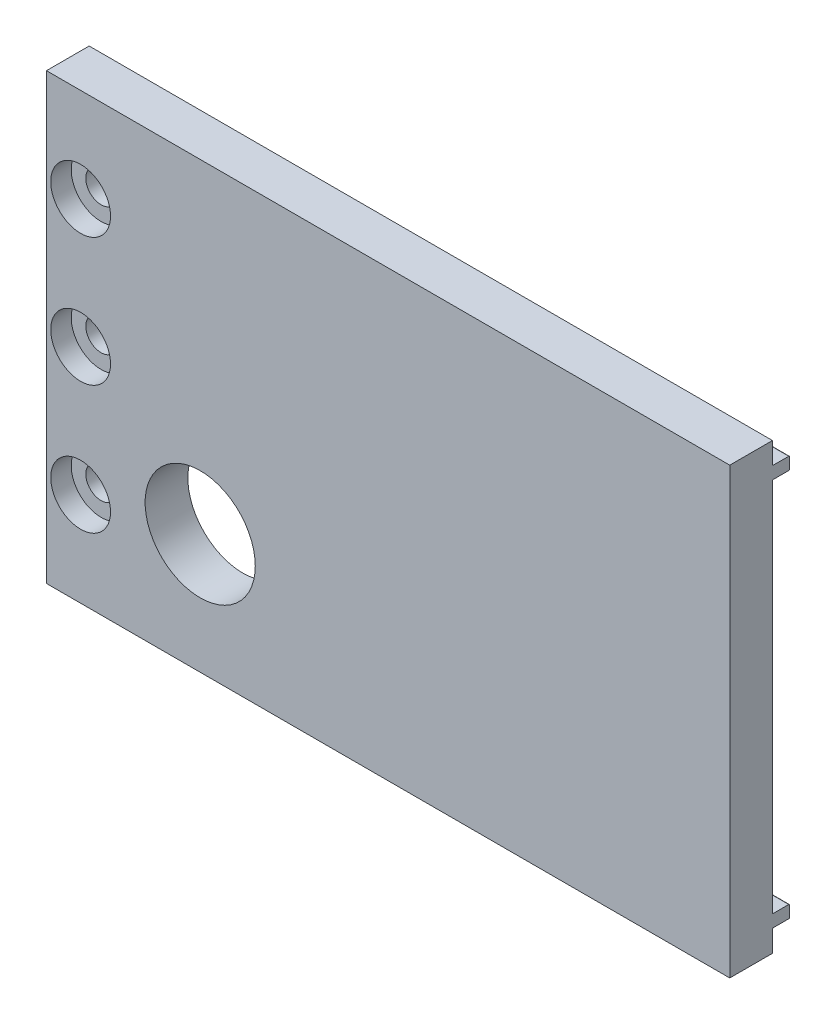
ISO-10303-21;
HEADER;
FILE_DESCRIPTION(('STEP AP214'),'2;1');
FILE_NAME('part.step','',(''),(''),'','','');
FILE_SCHEMA(('AUTOMOTIVE_DESIGN { 1 0 10303 214 1 1 1 1 }'));
ENDSEC;
DATA;
#1=APPLICATION_CONTEXT('core data for automotive mechanical design processes');
#2=APPLICATION_PROTOCOL_DEFINITION('international standard','automotive_design',2000,#1);
#3=PRODUCT_CONTEXT('',#1,'mechanical');
#4=PRODUCT('Part','Part','',(#3));
#5=PRODUCT_RELATED_PRODUCT_CATEGORY('part','',(#4));
#6=PRODUCT_DEFINITION_FORMATION('','',#4);
#7=PRODUCT_DEFINITION_CONTEXT('part definition',#1,'design');
#8=PRODUCT_DEFINITION('design','',#6,#7);
#9=PRODUCT_DEFINITION_SHAPE('','',#8);
#10=(LENGTH_UNIT() NAMED_UNIT(*) SI_UNIT(.MILLI.,.METRE.));
#11=(NAMED_UNIT(*) PLANE_ANGLE_UNIT() SI_UNIT($,.RADIAN.));
#12=(NAMED_UNIT(*) SI_UNIT($,.STERADIAN.) SOLID_ANGLE_UNIT());
#13=UNCERTAINTY_MEASURE_WITH_UNIT(LENGTH_MEASURE(1.E-05),#10,'distance_accuracy_value','');
#14=(GEOMETRIC_REPRESENTATION_CONTEXT(3) GLOBAL_UNCERTAINTY_ASSIGNED_CONTEXT((#13)) GLOBAL_UNIT_ASSIGNED_CONTEXT((#10,
#11,#12)) REPRESENTATION_CONTEXT('',''));
#15=CARTESIAN_POINT('',(0.,0.,0.));
#16=DIRECTION('',(0.,0.,1.));
#17=DIRECTION('',(1.,0.,0.));
#18=AXIS2_PLACEMENT_3D('',#15,#16,#17);
#19=CARTESIAN_POINT('',(0.,0.,16.9801166404574));
#20=DIRECTION('',(0.,0.,1.));
#21=DIRECTION('',(1.,0.,0.));
#22=AXIS2_PLACEMENT_3D('',#19,#20,#21);
#23=PLANE('',#22);
#24=CARTESIAN_POINT('',(-80.4443030659333,9.06656930573061,16.9801166404574));
#25=DIRECTION('',(0.,0.,1.));
#26=DIRECTION('',(1.,0.,0.));
#27=AXIS2_PLACEMENT_3D('',#24,#25,#26);
#28=CIRCLE('',#27,1.8);
#29=CARTESIAN_POINT('',(-78.6443030659333,9.06656930573061,16.9801166404574));
#30=VERTEX_POINT('',#29);
#31=EDGE_CURVE('E328',#30,#30,#28,.T.);
#32=ORIENTED_EDGE('',*,*,#31,.T.);
#33=EDGE_LOOP('',(#32));
#34=FACE_BOUND('',#33,.T.);
#35=CARTESIAN_POINT('',(-80.4443030659333,24.0665693057306,16.9801166404574));
#36=DIRECTION('',(0.,0.,1.));
#37=DIRECTION('',(1.,0.,0.));
#38=AXIS2_PLACEMENT_3D('',#35,#36,#37);
#39=CIRCLE('',#38,1.8);
#40=CARTESIAN_POINT('',(-78.6443030659333,24.0665693057306,16.9801166404574));
#41=VERTEX_POINT('',#40);
#42=EDGE_CURVE('E316',#41,#41,#39,.T.);
#43=ORIENTED_EDGE('',*,*,#42,.T.);
#44=EDGE_LOOP('',(#43));
#45=FACE_BOUND('',#44,.T.);
#46=CARTESIAN_POINT('',(-80.4443030659333,39.0665693057306,16.9801166404574));
#47=DIRECTION('',(0.,0.,1.));
#48=DIRECTION('',(1.,0.,0.));
#49=AXIS2_PLACEMENT_3D('',#46,#47,#48);
#50=CIRCLE('',#49,1.8);
#51=CARTESIAN_POINT('',(-78.6443030659333,39.0665693057306,16.9801166404574));
#52=VERTEX_POINT('',#51);
#53=EDGE_CURVE('E302',#52,#52,#50,.T.);
#54=ORIENTED_EDGE('',*,*,#53,.T.);
#55=EDGE_LOOP('',(#54));
#56=FACE_BOUND('',#55,.T.);
#57=CARTESIAN_POINT('',(-66.4443030659333,12.061734253213,16.9801166404574));
#58=DIRECTION('',(0.,0.,1.));
#59=DIRECTION('',(1.,0.,0.));
#60=AXIS2_PLACEMENT_3D('',#57,#58,#59);
#61=CIRCLE('',#60,6.44785946430932);
#62=CARTESIAN_POINT('',(-59.996443601624,12.061734253213,16.9801166404574));
#63=VERTEX_POINT('',#62);
#64=EDGE_CURVE('E293',#63,#63,#61,.T.);
#65=ORIENTED_EDGE('',*,*,#64,.T.);
#66=EDGE_LOOP('',(#65));
#67=FACE_BOUND('',#66,.T.);
#68=DIRECTION('',(0.,1.,0.));
#69=VECTOR('',#68,1.);
#70=CARTESIAN_POINT('',(-76.4443030659333,46.0665693057306,16.9801166404574));
#71=LINE('',#70,#69);
#72=CARTESIAN_POINT('',(-76.4443030659333,45.9665693057306,16.9801166404574));
#73=VERTEX_POINT('',#72);
#74=CARTESIAN_POINT('',(-76.4443030659333,47.6165693057306,16.9801166404574));
#75=VERTEX_POINT('',#74);
#76=EDGE_CURVE('E48',#73,#75,#71,.T.);
#77=ORIENTED_EDGE('',*,*,#76,.F.);
#78=DIRECTION('',(-1.,0.,0.));
#79=VECTOR('',#78,1.);
#80=CARTESIAN_POINT('',(-4.4443030659333,45.9665693057306,16.9801166404574));
#81=LINE('',#80,#79);
#82=CARTESIAN_POINT('',(-4.44430306593331,45.9665693057306,16.9801166404574));
#83=VERTEX_POINT('',#82);
#84=EDGE_CURVE('E251',#73,#83,#81,.F.);
#85=ORIENTED_EDGE('',*,*,#84,.T.);
#86=DIRECTION('',(0.,1.,0.));
#87=VECTOR('',#86,1.);
#88=CARTESIAN_POINT('',(-4.44430306593331,50.0665693057306,16.9801166404574));
#89=LINE('',#88,#87);
#90=CARTESIAN_POINT('',(-4.4443030659333,2.16656930573062,16.9801166404574));
#91=VERTEX_POINT('',#90);
#92=EDGE_CURVE('E283',#91,#83,#89,.T.);
#93=ORIENTED_EDGE('',*,*,#92,.F.);
#94=DIRECTION('',(1.,0.,0.));
#95=VECTOR('',#94,1.);
#96=CARTESIAN_POINT('',(-76.4443030659333,2.16656930573061,16.9801166404574));
#97=LINE('',#96,#95);
#98=CARTESIAN_POINT('',(-76.4443030659333,2.16656930573061,16.9801166404574));
#99=VERTEX_POINT('',#98);
#100=EDGE_CURVE('E246',#91,#99,#97,.F.);
#101=ORIENTED_EDGE('',*,*,#100,.T.);
#102=DIRECTION('',(0.,1.,0.));
#103=VECTOR('',#102,1.);
#104=CARTESIAN_POINT('',(-76.4443030659333,2.06656930573061,16.9801166404574));
#105=LINE('',#104,#103);
#106=CARTESIAN_POINT('',(-76.4443030659333,0.516569305730608,16.9801166404574));
#107=VERTEX_POINT('',#106);
#108=EDGE_CURVE('E270',#107,#99,#105,.T.);
#109=ORIENTED_EDGE('',*,*,#108,.F.);
#110=DIRECTION('',(-1.,0.,0.));
#111=VECTOR('',#110,1.);
#112=CARTESIAN_POINT('',(-4.4443030659333,0.516569305730608,16.9801166404574));
#113=LINE('',#112,#111);
#114=CARTESIAN_POINT('',(-4.4443030659333,0.516569305730623,16.9801166404574));
#115=VERTEX_POINT('',#114);
#116=EDGE_CURVE('E244',#107,#115,#113,.F.);
#117=ORIENTED_EDGE('',*,*,#116,.T.);
#118=CARTESIAN_POINT('',(-4.4443030659333,-1.93343069426939,16.9801166404574));
#119=VERTEX_POINT('',#118);
#120=EDGE_CURVE('E278',#119,#115,#89,.T.);
#121=ORIENTED_EDGE('',*,*,#120,.F.);
#122=DIRECTION('',(1.,0.,0.));
#123=VECTOR('',#122,1.);
#124=CARTESIAN_POINT('',(-84.4443030659333,-1.93343069426939,16.9801166404574));
#125=LINE('',#124,#123);
#126=CARTESIAN_POINT('',(-84.4443030659333,-1.93343069426939,16.9801166404574));
#127=VERTEX_POINT('',#126);
#128=EDGE_CURVE('E289',#127,#119,#125,.T.);
#129=ORIENTED_EDGE('',*,*,#128,.F.);
#130=DIRECTION('',(0.,-1.,0.));
#131=VECTOR('',#130,1.);
#132=CARTESIAN_POINT('',(-84.4443030659333,50.0665693057306,16.9801166404574));
#133=LINE('',#132,#131);
#134=CARTESIAN_POINT('',(-84.4443030659333,50.0665693057306,16.9801166404574));
#135=VERTEX_POINT('',#134);
#136=EDGE_CURVE('E190',#135,#127,#133,.T.);
#137=ORIENTED_EDGE('',*,*,#136,.F.);
#138=DIRECTION('',(-1.,0.,0.));
#139=VECTOR('',#138,1.);
#140=CARTESIAN_POINT('',(-84.4443030659333,50.0665693057306,16.9801166404574));
#141=LINE('',#140,#139);
#142=CARTESIAN_POINT('',(-4.44430306593331,50.0665693057306,16.9801166404574));
#143=VERTEX_POINT('',#142);
#144=EDGE_CURVE('E186',#143,#135,#141,.T.);
#145=ORIENTED_EDGE('',*,*,#144,.F.);
#146=CARTESIAN_POINT('',(-4.44430306593331,47.6165693057306,16.9801166404574));
#147=VERTEX_POINT('',#146);
#148=EDGE_CURVE('E285',#147,#143,#89,.T.);
#149=ORIENTED_EDGE('',*,*,#148,.F.);
#150=DIRECTION('',(1.,0.,0.));
#151=VECTOR('',#150,1.);
#152=CARTESIAN_POINT('',(-76.4443030659333,47.6165693057306,16.9801166404574));
#153=LINE('',#152,#151);
#154=EDGE_CURVE('E249',#147,#75,#153,.F.);
#155=ORIENTED_EDGE('',*,*,#154,.T.);
#156=EDGE_LOOP('',(#77,#85,#93,#101,#109,#117,#121,#129,#137,#145,#149,#155));
#157=FACE_BOUND('',#156,.T.);
#158=ADVANCED_FACE('F33',(#34,#45,#56,#67,#157),#23,.F.);
#159=CARTESIAN_POINT('',(-84.4443030659333,50.0665693057306,21.9801166404574));
#160=DIRECTION('',(1.,0.,0.));
#161=DIRECTION('',(0.,1.,0.));
#162=AXIS2_PLACEMENT_3D('',#159,#160,#161);
#163=PLANE('',#162);
#164=ORIENTED_EDGE('',*,*,#136,.T.);
#165=DIRECTION('',(0.,0.,-1.));
#166=VECTOR('',#165,1.);
#167=CARTESIAN_POINT('',(-84.4443030659333,-1.93343069426939,21.9801166404574));
#168=LINE('',#167,#166);
#169=CARTESIAN_POINT('',(-84.4443030659333,-1.93343069426939,21.9801166404574));
#170=VERTEX_POINT('',#169);
#171=EDGE_CURVE('E170',#170,#127,#168,.T.);
#172=ORIENTED_EDGE('',*,*,#171,.F.);
#173=DIRECTION('',(0.,-1.,0.));
#174=VECTOR('',#173,1.);
#175=CARTESIAN_POINT('',(-84.4443030659333,50.0665693057306,21.9801166404574));
#176=LINE('',#175,#174);
#177=CARTESIAN_POINT('',(-84.4443030659333,50.0665693057306,21.9801166404574));
#178=VERTEX_POINT('',#177);
#179=EDGE_CURVE('E177',#178,#170,#176,.T.);
#180=ORIENTED_EDGE('',*,*,#179,.F.);
#181=DIRECTION('',(0.,0.,-1.));
#182=VECTOR('',#181,1.);
#183=CARTESIAN_POINT('',(-84.4443030659333,50.0665693057306,21.9801166404574));
#184=LINE('',#183,#182);
#185=EDGE_CURVE('E297',#178,#135,#184,.T.);
#186=ORIENTED_EDGE('',*,*,#185,.T.);
#187=EDGE_LOOP('',(#164,#172,#180,#186));
#188=FACE_BOUND('',#187,.T.);
#189=ADVANCED_FACE('F188',(#188),#163,.F.);
#190=CARTESIAN_POINT('',(-84.4443030659333,-1.93343069426939,21.9801166404574));
#191=DIRECTION('',(0.,1.,0.));
#192=DIRECTION('',(0.,0.,1.));
#193=AXIS2_PLACEMENT_3D('',#190,#191,#192);
#194=PLANE('',#193);
#195=ORIENTED_EDGE('',*,*,#128,.T.);
#196=DIRECTION('',(0.,0.,-1.));
#197=VECTOR('',#196,1.);
#198=CARTESIAN_POINT('',(-4.4443030659333,-1.93343069426939,21.9801166404574));
#199=LINE('',#198,#197);
#200=CARTESIAN_POINT('',(-4.4443030659333,-1.93343069426939,21.9801166404574));
#201=VERTEX_POINT('',#200);
#202=EDGE_CURVE('E173',#201,#119,#199,.T.);
#203=ORIENTED_EDGE('',*,*,#202,.F.);
#204=DIRECTION('',(1.,0.,0.));
#205=VECTOR('',#204,1.);
#206=CARTESIAN_POINT('',(-84.4443030659333,-1.93343069426939,21.9801166404574));
#207=LINE('',#206,#205);
#208=EDGE_CURVE('E166',#170,#201,#207,.T.);
#209=ORIENTED_EDGE('',*,*,#208,.F.);
#210=ORIENTED_EDGE('',*,*,#171,.T.);
#211=EDGE_LOOP('',(#195,#203,#209,#210));
#212=FACE_BOUND('',#211,.T.);
#213=ADVANCED_FACE('F168',(#212),#194,.F.);
#214=CARTESIAN_POINT('',(-4.44430306593331,50.0665693057306,21.9801166404574));
#215=DIRECTION('',(-1.,0.,0.));
#216=DIRECTION('',(0.,-1.,0.));
#217=AXIS2_PLACEMENT_3D('',#214,#215,#216);
#218=PLANE('',#217);
#219=DIRECTION('',(0.,0.,1.));
#220=VECTOR('',#219,1.);
#221=CARTESIAN_POINT('',(-4.4443030659333,0.616569305730608,14.9801166404574));
#222=LINE('',#221,#220);
#223=CARTESIAN_POINT('',(-4.4443030659333,0.616569305730608,15.0801166404574));
#224=VERTEX_POINT('',#223);
#225=CARTESIAN_POINT('',(-4.4443030659333,0.616569305730608,16.8801166404574));
#226=VERTEX_POINT('',#225);
#227=EDGE_CURVE('E340',#224,#226,#222,.T.);
#228=ORIENTED_EDGE('',*,*,#227,.F.);
#229=CARTESIAN_POINT('',(-4.4443030659333,0.716569305730608,15.0801166404574));
#230=DIRECTION('',(-1.,0.,0.));
#231=DIRECTION('',(0.,-1.,0.));
#232=AXIS2_PLACEMENT_3D('',#229,#230,#231);
#233=CIRCLE('',#232,0.1);
#234=CARTESIAN_POINT('',(-4.4443030659333,0.716569305730608,14.9801166404574));
#235=VERTEX_POINT('',#234);
#236=EDGE_CURVE('E217',#224,#235,#233,.F.);
#237=ORIENTED_EDGE('',*,*,#236,.T.);
#238=DIRECTION('',(0.,-1.,0.));
#239=VECTOR('',#238,1.);
#240=CARTESIAN_POINT('',(-4.4443030659333,2.06656930573061,14.9801166404574));
#241=LINE('',#240,#239);
#242=CARTESIAN_POINT('',(-4.4443030659333,1.96656930573061,14.9801166404574));
#243=VERTEX_POINT('',#242);
#244=EDGE_CURVE('E351',#243,#235,#241,.T.);
#245=ORIENTED_EDGE('',*,*,#244,.F.);
#246=CARTESIAN_POINT('',(-4.4443030659333,1.96656930573061,15.0801166404574));
#247=DIRECTION('',(-1.,0.,0.));
#248=DIRECTION('',(0.,-1.,0.));
#249=AXIS2_PLACEMENT_3D('',#246,#247,#248);
#250=CIRCLE('',#249,0.1);
#251=CARTESIAN_POINT('',(-4.4443030659333,2.06656930573061,15.0801166404574));
#252=VERTEX_POINT('',#251);
#253=EDGE_CURVE('E215',#243,#252,#250,.F.);
#254=ORIENTED_EDGE('',*,*,#253,.T.);
#255=DIRECTION('',(0.,0.,1.));
#256=VECTOR('',#255,1.);
#257=CARTESIAN_POINT('',(-4.4443030659333,2.06656930573061,14.9801166404574));
#258=LINE('',#257,#256);
#259=CARTESIAN_POINT('',(-4.4443030659333,2.06656930573061,16.8801166404574));
#260=VERTEX_POINT('',#259);
#261=EDGE_CURVE('E346',#252,#260,#258,.T.);
#262=ORIENTED_EDGE('',*,*,#261,.T.);
#263=CARTESIAN_POINT('',(-4.4443030659333,2.16656930573061,16.8801166404574));
#264=DIRECTION('',(-1.,0.,0.));
#265=DIRECTION('',(0.,-1.,0.));
#266=AXIS2_PLACEMENT_3D('',#263,#264,#265);
#267=CIRCLE('',#266,0.1);
#268=EDGE_CURVE('E261',#260,#91,#267,.T.);
#269=ORIENTED_EDGE('',*,*,#268,.T.);
#270=ORIENTED_EDGE('',*,*,#92,.T.);
#271=CARTESIAN_POINT('',(-4.44430306593331,45.9665693057306,16.8801166404574));
#272=DIRECTION('',(-1.,0.,0.));
#273=DIRECTION('',(0.,-1.,0.));
#274=AXIS2_PLACEMENT_3D('',#271,#272,#273);
#275=CIRCLE('',#274,0.1);
#276=CARTESIAN_POINT('',(-4.4443030659333,46.0665693057306,16.8801166404574));
#277=VERTEX_POINT('',#276);
#278=EDGE_CURVE('E255',#83,#277,#275,.T.);
#279=ORIENTED_EDGE('',*,*,#278,.T.);
#280=DIRECTION('',(0.,0.,1.));
#281=VECTOR('',#280,1.);
#282=CARTESIAN_POINT('',(-4.4443030659333,46.0665693057306,14.9801166404574));
#283=LINE('',#282,#281);
#284=CARTESIAN_POINT('',(-4.4443030659333,46.0665693057306,15.0801166404574));
#285=VERTEX_POINT('',#284);
#286=EDGE_CURVE('E365',#285,#277,#283,.T.);
#287=ORIENTED_EDGE('',*,*,#286,.F.);
#288=CARTESIAN_POINT('',(-4.44430306593331,46.1665693057306,15.0801166404574));
#289=DIRECTION('',(-1.,0.,0.));
#290=DIRECTION('',(0.,-1.,0.));
#291=AXIS2_PLACEMENT_3D('',#288,#289,#290);
#292=CIRCLE('',#291,0.1);
#293=CARTESIAN_POINT('',(-4.4443030659333,46.1665693057306,14.9801166404574));
#294=VERTEX_POINT('',#293);
#295=EDGE_CURVE('E211',#285,#294,#292,.F.);
#296=ORIENTED_EDGE('',*,*,#295,.T.);
#297=DIRECTION('',(0.,-1.,0.));
#298=VECTOR('',#297,1.);
#299=CARTESIAN_POINT('',(-4.4443030659333,46.0665693057306,14.9801166404574));
#300=LINE('',#299,#298);
#301=CARTESIAN_POINT('',(-4.4443030659333,47.4165693057306,14.9801166404574));
#302=VERTEX_POINT('',#301);
#303=EDGE_CURVE('E368',#302,#294,#300,.T.);
#304=ORIENTED_EDGE('',*,*,#303,.F.);
#305=CARTESIAN_POINT('',(-4.44430306593331,47.4165693057306,15.0801166404574));
#306=DIRECTION('',(-1.,0.,0.));
#307=DIRECTION('',(0.,-1.,0.));
#308=AXIS2_PLACEMENT_3D('',#305,#306,#307);
#309=CIRCLE('',#308,0.1);
#310=CARTESIAN_POINT('',(-4.4443030659333,47.5165693057306,15.0801166404574));
#311=VERTEX_POINT('',#310);
#312=EDGE_CURVE('E213',#302,#311,#309,.F.);
#313=ORIENTED_EDGE('',*,*,#312,.T.);
#314=DIRECTION('',(0.,0.,1.));
#315=VECTOR('',#314,1.);
#316=CARTESIAN_POINT('',(-4.4443030659333,47.5165693057306,14.9801166404574));
#317=LINE('',#316,#315);
#318=CARTESIAN_POINT('',(-4.4443030659333,47.5165693057306,16.8801166404574));
#319=VERTEX_POINT('',#318);
#320=EDGE_CURVE('E362',#311,#319,#317,.T.);
#321=ORIENTED_EDGE('',*,*,#320,.T.);
#322=CARTESIAN_POINT('',(-4.44430306593331,47.6165693057306,16.8801166404574));
#323=DIRECTION('',(-1.,0.,0.));
#324=DIRECTION('',(0.,-1.,0.));
#325=AXIS2_PLACEMENT_3D('',#322,#323,#324);
#326=CIRCLE('',#325,0.1);
#327=EDGE_CURVE('E257',#319,#147,#326,.T.);
#328=ORIENTED_EDGE('',*,*,#327,.T.);
#329=ORIENTED_EDGE('',*,*,#148,.T.);
#330=DIRECTION('',(0.,0.,-1.));
#331=VECTOR('',#330,1.);
#332=CARTESIAN_POINT('',(-4.44430306593331,50.0665693057306,21.9801166404574));
#333=LINE('',#332,#331);
#334=CARTESIAN_POINT('',(-4.44430306593331,50.0665693057306,21.9801166404574));
#335=VERTEX_POINT('',#334);
#336=EDGE_CURVE('E196',#335,#143,#333,.T.);
#337=ORIENTED_EDGE('',*,*,#336,.F.);
#338=DIRECTION('',(0.,1.,0.));
#339=VECTOR('',#338,1.);
#340=CARTESIAN_POINT('',(-4.44430306593331,50.0665693057306,21.9801166404574));
#341=LINE('',#340,#339);
#342=EDGE_CURVE('E176',#201,#335,#341,.T.);
#343=ORIENTED_EDGE('',*,*,#342,.F.);
#344=ORIENTED_EDGE('',*,*,#202,.T.);
#345=ORIENTED_EDGE('',*,*,#120,.T.);
#346=CARTESIAN_POINT('',(-4.4443030659333,0.516569305730608,16.8801166404574));
#347=DIRECTION('',(-1.,0.,0.));
#348=DIRECTION('',(0.,-1.,0.));
#349=AXIS2_PLACEMENT_3D('',#346,#347,#348);
#350=CIRCLE('',#349,0.1);
#351=EDGE_CURVE('E11',#115,#226,#350,.T.);
#352=ORIENTED_EDGE('',*,*,#351,.T.);
#353=EDGE_LOOP('',(#228,#237,#245,#254,#262,#269,#270,#279,#287,#296,#304,#313,#321,#328,#329,
#337,#343,#344,#345,#352));
#354=FACE_BOUND('',#353,.T.);
#355=ADVANCED_FACE('F281',(#354),#218,.F.);
#356=CARTESIAN_POINT('',(-84.4443030659333,50.0665693057306,21.9801166404574));
#357=DIRECTION('',(0.,-1.,0.));
#358=DIRECTION('',(0.,0.,-1.));
#359=AXIS2_PLACEMENT_3D('',#356,#357,#358);
#360=PLANE('',#359);
#361=ORIENTED_EDGE('',*,*,#144,.T.);
#362=ORIENTED_EDGE('',*,*,#185,.F.);
#363=DIRECTION('',(-1.,0.,0.));
#364=VECTOR('',#363,1.);
#365=CARTESIAN_POINT('',(-84.4443030659333,50.0665693057306,21.9801166404574));
#366=LINE('',#365,#364);
#367=EDGE_CURVE('E182',#335,#178,#366,.T.);
#368=ORIENTED_EDGE('',*,*,#367,.F.);
#369=ORIENTED_EDGE('',*,*,#336,.T.);
#370=EDGE_LOOP('',(#361,#362,#368,#369));
#371=FACE_BOUND('',#370,.T.);
#372=ADVANCED_FACE('F395',(#371),#360,.F.);
#373=CARTESIAN_POINT('',(0.,0.,21.9801166404574));
#374=DIRECTION('',(0.,0.,1.));
#375=DIRECTION('',(1.,0.,0.));
#376=AXIS2_PLACEMENT_3D('',#373,#374,#375);
#377=PLANE('',#376);
#378=CARTESIAN_POINT('',(-80.4443030659333,9.06656930573061,21.9801166404574));
#379=DIRECTION('',(0.,0.,1.));
#380=DIRECTION('',(1.,0.,0.));
#381=AXIS2_PLACEMENT_3D('',#378,#379,#380);
#382=CIRCLE('',#381,3.5);
#383=CARTESIAN_POINT('',(-76.9443030659333,9.06656930573061,21.9801166404574));
#384=VERTEX_POINT('',#383);
#385=EDGE_CURVE('E337',#384,#384,#382,.T.);
#386=ORIENTED_EDGE('',*,*,#385,.F.);
#387=EDGE_LOOP('',(#386));
#388=FACE_BOUND('',#387,.T.);
#389=CARTESIAN_POINT('',(-80.4443030659333,24.0665693057306,21.9801166404574));
#390=DIRECTION('',(0.,0.,1.));
#391=DIRECTION('',(1.,0.,0.));
#392=AXIS2_PLACEMENT_3D('',#389,#390,#391);
#393=CIRCLE('',#392,3.5);
#394=CARTESIAN_POINT('',(-76.9443030659333,24.0665693057306,21.9801166404574));
#395=VERTEX_POINT('',#394);
#396=EDGE_CURVE('E325',#395,#395,#393,.T.);
#397=ORIENTED_EDGE('',*,*,#396,.F.);
#398=EDGE_LOOP('',(#397));
#399=FACE_BOUND('',#398,.T.);
#400=CARTESIAN_POINT('',(-80.4443030659333,39.0665693057306,21.9801166404574));
#401=DIRECTION('',(0.,0.,1.));
#402=DIRECTION('',(1.,0.,0.));
#403=AXIS2_PLACEMENT_3D('',#400,#401,#402);
#404=CIRCLE('',#403,3.5);
#405=CARTESIAN_POINT('',(-76.9443030659333,39.0665693057306,21.9801166404574));
#406=VERTEX_POINT('',#405);
#407=EDGE_CURVE('E313',#406,#406,#404,.T.);
#408=ORIENTED_EDGE('',*,*,#407,.F.);
#409=EDGE_LOOP('',(#408));
#410=FACE_BOUND('',#409,.T.);
#411=CARTESIAN_POINT('',(-66.4443030659333,12.061734253213,21.9801166404574));
#412=DIRECTION('',(0.,0.,1.));
#413=DIRECTION('',(1.,0.,0.));
#414=AXIS2_PLACEMENT_3D('',#411,#412,#413);
#415=CIRCLE('',#414,6.44785946430932);
#416=CARTESIAN_POINT('',(-59.996443601624,12.061734253213,21.9801166404574));
#417=VERTEX_POINT('',#416);
#418=EDGE_CURVE('E299',#417,#417,#415,.T.);
#419=ORIENTED_EDGE('',*,*,#418,.F.);
#420=EDGE_LOOP('',(#419));
#421=FACE_BOUND('',#420,.T.);
#422=ORIENTED_EDGE('',*,*,#179,.T.);
#423=ORIENTED_EDGE('',*,*,#208,.T.);
#424=ORIENTED_EDGE('',*,*,#342,.T.);
#425=ORIENTED_EDGE('',*,*,#367,.T.);
#426=EDGE_LOOP('',(#422,#423,#424,#425));
#427=FACE_BOUND('',#426,.T.);
#428=ADVANCED_FACE('F180',(#388,#399,#410,#421,#427),#377,.T.);
#429=CARTESIAN_POINT('',(-66.4443030659333,12.061734253213,16.9801166404574));
#430=DIRECTION('',(0.,0.,1.));
#431=DIRECTION('',(1.,0.,0.));
#432=AXIS2_PLACEMENT_3D('',#429,#430,#431);
#433=CYLINDRICAL_SURFACE('',#432,6.44785946430932);
#434=ORIENTED_EDGE('',*,*,#64,.F.);
#435=EDGE_LOOP('',(#434));
#436=FACE_BOUND('',#435,.T.);
#437=ORIENTED_EDGE('',*,*,#418,.T.);
#438=EDGE_LOOP('',(#437));
#439=FACE_BOUND('',#438,.T.);
#440=ADVANCED_FACE('F403',(#436,#439),#433,.F.);
#441=CARTESIAN_POINT('',(-80.4443030659333,39.0665693057306,21.9801166404574));
#442=DIRECTION('',(0.,0.,1.));
#443=DIRECTION('',(1.,0.,0.));
#444=AXIS2_PLACEMENT_3D('',#441,#442,#443);
#445=CYLINDRICAL_SURFACE('',#444,1.8);
#446=ORIENTED_EDGE('',*,*,#53,.F.);
#447=EDGE_LOOP('',(#446));
#448=FACE_BOUND('',#447,.T.);
#449=CARTESIAN_POINT('',(-80.4443030659333,39.0665693057306,19.5801166404574));
#450=DIRECTION('',(0.,0.,1.));
#451=DIRECTION('',(1.,0.,0.));
#452=AXIS2_PLACEMENT_3D('',#449,#450,#451);
#453=CIRCLE('',#452,1.8);
#454=CARTESIAN_POINT('',(-78.6443030659333,39.0665693057306,19.5801166404574));
#455=VERTEX_POINT('',#454);
#456=EDGE_CURVE('E307',#455,#455,#453,.T.);
#457=ORIENTED_EDGE('',*,*,#456,.T.);
#458=EDGE_LOOP('',(#457));
#459=FACE_BOUND('',#458,.T.);
#460=ADVANCED_FACE('F418',(#448,#459),#445,.F.);
#461=CARTESIAN_POINT('',(-78.6443030659333,39.0665693057306,19.5801166404574));
#462=DIRECTION('',(0.,0.,-1.));
#463=DIRECTION('',(-1.,0.,0.));
#464=AXIS2_PLACEMENT_3D('',#461,#462,#463);
#465=PLANE('',#464);
#466=ORIENTED_EDGE('',*,*,#456,.F.);
#467=EDGE_LOOP('',(#466));
#468=FACE_BOUND('',#467,.T.);
#469=CARTESIAN_POINT('',(-80.4443030659333,39.0665693057306,19.5801166404574));
#470=DIRECTION('',(0.,0.,1.));
#471=DIRECTION('',(1.,0.,0.));
#472=AXIS2_PLACEMENT_3D('',#469,#470,#471);
#473=CIRCLE('',#472,3.5);
#474=CARTESIAN_POINT('',(-76.9443030659333,39.0665693057306,19.5801166404574));
#475=VERTEX_POINT('',#474);
#476=EDGE_CURVE('E310',#475,#475,#473,.T.);
#477=ORIENTED_EDGE('',*,*,#476,.T.);
#478=EDGE_LOOP('',(#477));
#479=FACE_BOUND('',#478,.T.);
#480=ADVANCED_FACE('F422',(#468,#479),#465,.F.);
#481=CARTESIAN_POINT('',(-80.4443030659333,39.0665693057306,21.9801166404574));
#482=DIRECTION('',(0.,0.,1.));
#483=DIRECTION('',(1.,0.,0.));
#484=AXIS2_PLACEMENT_3D('',#481,#482,#483);
#485=CYLINDRICAL_SURFACE('',#484,3.5);
#486=ORIENTED_EDGE('',*,*,#476,.F.);
#487=EDGE_LOOP('',(#486));
#488=FACE_BOUND('',#487,.T.);
#489=ORIENTED_EDGE('',*,*,#407,.T.);
#490=EDGE_LOOP('',(#489));
#491=FACE_BOUND('',#490,.T.);
#492=ADVANCED_FACE('F426',(#488,#491),#485,.F.);
#493=CARTESIAN_POINT('',(-80.4443030659333,24.0665693057306,21.9801166404574));
#494=DIRECTION('',(0.,0.,1.));
#495=DIRECTION('',(1.,0.,0.));
#496=AXIS2_PLACEMENT_3D('',#493,#494,#495);
#497=CYLINDRICAL_SURFACE('',#496,1.8);
#498=ORIENTED_EDGE('',*,*,#42,.F.);
#499=EDGE_LOOP('',(#498));
#500=FACE_BOUND('',#499,.T.);
#501=CARTESIAN_POINT('',(-80.4443030659333,24.0665693057306,19.5801166404574));
#502=DIRECTION('',(0.,0.,1.));
#503=DIRECTION('',(1.,0.,0.));
#504=AXIS2_PLACEMENT_3D('',#501,#502,#503);
#505=CIRCLE('',#504,1.8);
#506=CARTESIAN_POINT('',(-78.6443030659333,24.0665693057306,19.5801166404574));
#507=VERTEX_POINT('',#506);
#508=EDGE_CURVE('E319',#507,#507,#505,.T.);
#509=ORIENTED_EDGE('',*,*,#508,.T.);
#510=EDGE_LOOP('',(#509));
#511=FACE_BOUND('',#510,.T.);
#512=ADVANCED_FACE('F430',(#500,#511),#497,.F.);
#513=CARTESIAN_POINT('',(-78.6443030659333,24.0665693057306,19.5801166404574));
#514=DIRECTION('',(0.,0.,-1.));
#515=DIRECTION('',(-1.,0.,0.));
#516=AXIS2_PLACEMENT_3D('',#513,#514,#515);
#517=PLANE('',#516);
#518=ORIENTED_EDGE('',*,*,#508,.F.);
#519=EDGE_LOOP('',(#518));
#520=FACE_BOUND('',#519,.T.);
#521=CARTESIAN_POINT('',(-80.4443030659333,24.0665693057306,19.5801166404574));
#522=DIRECTION('',(0.,0.,1.));
#523=DIRECTION('',(1.,0.,0.));
#524=AXIS2_PLACEMENT_3D('',#521,#522,#523);
#525=CIRCLE('',#524,3.5);
#526=CARTESIAN_POINT('',(-76.9443030659333,24.0665693057306,19.5801166404574));
#527=VERTEX_POINT('',#526);
#528=EDGE_CURVE('E322',#527,#527,#525,.T.);
#529=ORIENTED_EDGE('',*,*,#528,.T.);
#530=EDGE_LOOP('',(#529));
#531=FACE_BOUND('',#530,.T.);
#532=ADVANCED_FACE('F434',(#520,#531),#517,.F.);
#533=CARTESIAN_POINT('',(-80.4443030659333,24.0665693057306,21.9801166404574));
#534=DIRECTION('',(0.,0.,1.));
#535=DIRECTION('',(1.,0.,0.));
#536=AXIS2_PLACEMENT_3D('',#533,#534,#535);
#537=CYLINDRICAL_SURFACE('',#536,3.5);
#538=ORIENTED_EDGE('',*,*,#528,.F.);
#539=EDGE_LOOP('',(#538));
#540=FACE_BOUND('',#539,.T.);
#541=ORIENTED_EDGE('',*,*,#396,.T.);
#542=EDGE_LOOP('',(#541));
#543=FACE_BOUND('',#542,.T.);
#544=ADVANCED_FACE('F438',(#540,#543),#537,.F.);
#545=CARTESIAN_POINT('',(-80.4443030659333,9.06656930573061,21.9801166404574));
#546=DIRECTION('',(0.,0.,1.));
#547=DIRECTION('',(1.,0.,0.));
#548=AXIS2_PLACEMENT_3D('',#545,#546,#547);
#549=CYLINDRICAL_SURFACE('',#548,1.8);
#550=ORIENTED_EDGE('',*,*,#31,.F.);
#551=EDGE_LOOP('',(#550));
#552=FACE_BOUND('',#551,.T.);
#553=CARTESIAN_POINT('',(-80.4443030659333,9.06656930573061,19.5801166404574));
#554=DIRECTION('',(0.,0.,1.));
#555=DIRECTION('',(1.,0.,0.));
#556=AXIS2_PLACEMENT_3D('',#553,#554,#555);
#557=CIRCLE('',#556,1.8);
#558=CARTESIAN_POINT('',(-78.6443030659333,9.06656930573061,19.5801166404574));
#559=VERTEX_POINT('',#558);
#560=EDGE_CURVE('E331',#559,#559,#557,.T.);
#561=ORIENTED_EDGE('',*,*,#560,.T.);
#562=EDGE_LOOP('',(#561));
#563=FACE_BOUND('',#562,.T.);
#564=ADVANCED_FACE('F442',(#552,#563),#549,.F.);
#565=CARTESIAN_POINT('',(-78.6443030659333,9.06656930573061,19.5801166404574));
#566=DIRECTION('',(0.,0.,-1.));
#567=DIRECTION('',(-1.,0.,0.));
#568=AXIS2_PLACEMENT_3D('',#565,#566,#567);
#569=PLANE('',#568);
#570=ORIENTED_EDGE('',*,*,#560,.F.);
#571=EDGE_LOOP('',(#570));
#572=FACE_BOUND('',#571,.T.);
#573=CARTESIAN_POINT('',(-80.4443030659333,9.06656930573061,19.5801166404574));
#574=DIRECTION('',(0.,0.,1.));
#575=DIRECTION('',(1.,0.,0.));
#576=AXIS2_PLACEMENT_3D('',#573,#574,#575);
#577=CIRCLE('',#576,3.5);
#578=CARTESIAN_POINT('',(-76.9443030659333,9.06656930573061,19.5801166404574));
#579=VERTEX_POINT('',#578);
#580=EDGE_CURVE('E334',#579,#579,#577,.T.);
#581=ORIENTED_EDGE('',*,*,#580,.T.);
#582=EDGE_LOOP('',(#581));
#583=FACE_BOUND('',#582,.T.);
#584=ADVANCED_FACE('F446',(#572,#583),#569,.F.);
#585=CARTESIAN_POINT('',(-80.4443030659333,9.06656930573061,21.9801166404574));
#586=DIRECTION('',(0.,0.,1.));
#587=DIRECTION('',(1.,0.,0.));
#588=AXIS2_PLACEMENT_3D('',#585,#586,#587);
#589=CYLINDRICAL_SURFACE('',#588,3.5);
#590=ORIENTED_EDGE('',*,*,#580,.F.);
#591=EDGE_LOOP('',(#590));
#592=FACE_BOUND('',#591,.T.);
#593=ORIENTED_EDGE('',*,*,#385,.T.);
#594=EDGE_LOOP('',(#593));
#595=FACE_BOUND('',#594,.T.);
#596=ADVANCED_FACE('F450',(#592,#595),#589,.F.);
#597=CARTESIAN_POINT('',(-4.4443030659333,0.616569305730608,14.9801166404574));
#598=DIRECTION('',(0.,1.,0.));
#599=DIRECTION('',(0.,0.,1.));
#600=AXIS2_PLACEMENT_3D('',#597,#598,#599);
#601=PLANE('',#600);
#602=DIRECTION('',(0.,0.,1.));
#603=VECTOR('',#602,1.);
#604=CARTESIAN_POINT('',(-76.4443030659333,0.616569305730608,14.9801166404574));
#605=LINE('',#604,#603);
#606=CARTESIAN_POINT('',(-76.4443030659333,0.616569305730608,15.0801166404574));
#607=VERTEX_POINT('',#606);
#608=CARTESIAN_POINT('',(-76.4443030659333,0.616569305730608,16.8801166404574));
#609=VERTEX_POINT('',#608);
#610=EDGE_CURVE('E272',#607,#609,#605,.T.);
#611=ORIENTED_EDGE('',*,*,#610,.F.);
#612=DIRECTION('',(-1.,0.,0.));
#613=VECTOR('',#612,1.);
#614=CARTESIAN_POINT('',(-4.4443030659333,0.616569305730608,15.0801166404574));
#615=LINE('',#614,#613);
#616=EDGE_CURVE('E209',#607,#224,#615,.F.);
#617=ORIENTED_EDGE('',*,*,#616,.T.);
#618=ORIENTED_EDGE('',*,*,#227,.T.);
#619=DIRECTION('',(-1.,0.,0.));
#620=VECTOR('',#619,1.);
#621=CARTESIAN_POINT('',(-76.4443030659333,0.616569305730608,16.8801166404574));
#622=LINE('',#621,#620);
#623=EDGE_CURVE('E206',#226,#609,#622,.T.);
#624=ORIENTED_EDGE('',*,*,#623,.T.);
#625=EDGE_LOOP('',(#611,#617,#618,#624));
#626=FACE_BOUND('',#625,.T.);
#627=ADVANCED_FACE('F454',(#626),#601,.F.);
#628=CARTESIAN_POINT('',(-76.4443030659333,2.06656930573061,14.9801166404574));
#629=DIRECTION('',(1.,0.,0.));
#630=DIRECTION('',(0.,0.,-1.));
#631=AXIS2_PLACEMENT_3D('',#628,#629,#630);
#632=PLANE('',#631);
#633=DIRECTION('',(0.,1.,0.));
#634=VECTOR('',#633,1.);
#635=CARTESIAN_POINT('',(-76.4443030659333,2.06656930573061,14.9801166404574));
#636=LINE('',#635,#634);
#637=CARTESIAN_POINT('',(-76.4443030659333,0.716569305730608,14.9801166404574));
#638=VERTEX_POINT('',#637);
#639=CARTESIAN_POINT('',(-76.4443030659333,1.96656930573061,14.9801166404574));
#640=VERTEX_POINT('',#639);
#641=EDGE_CURVE('E349',#638,#640,#636,.T.);
#642=ORIENTED_EDGE('',*,*,#641,.F.);
#643=CARTESIAN_POINT('',(-76.4443030659333,0.716569305730608,15.0801166404574));
#644=DIRECTION('',(1.,0.,0.));
#645=DIRECTION('',(0.,0.,-1.));
#646=AXIS2_PLACEMENT_3D('',#643,#644,#645);
#647=CIRCLE('',#646,0.1);
#648=EDGE_CURVE('E204',#638,#607,#647,.F.);
#649=ORIENTED_EDGE('',*,*,#648,.T.);
#650=ORIENTED_EDGE('',*,*,#610,.T.);
#651=CARTESIAN_POINT('',(-76.4443030659333,0.516569305730608,16.8801166404574));
#652=DIRECTION('',(1.,0.,0.));
#653=DIRECTION('',(0.,0.,-1.));
#654=AXIS2_PLACEMENT_3D('',#651,#652,#653);
#655=CIRCLE('',#654,0.1);
#656=EDGE_CURVE('E41',#609,#107,#655,.T.);
#657=ORIENTED_EDGE('',*,*,#656,.T.);
#658=ORIENTED_EDGE('',*,*,#108,.T.);
#659=CARTESIAN_POINT('',(-76.4443030659333,2.16656930573061,16.8801166404574));
#660=DIRECTION('',(1.,0.,0.));
#661=DIRECTION('',(0.,0.,-1.));
#662=AXIS2_PLACEMENT_3D('',#659,#660,#661);
#663=CIRCLE('',#662,0.1);
#664=CARTESIAN_POINT('',(-76.4443030659333,2.06656930573061,16.8801166404574));
#665=VERTEX_POINT('',#664);
#666=EDGE_CURVE('E263',#99,#665,#663,.T.);
#667=ORIENTED_EDGE('',*,*,#666,.T.);
#668=DIRECTION('',(0.,0.,1.));
#669=VECTOR('',#668,1.);
#670=CARTESIAN_POINT('',(-76.4443030659333,2.06656930573061,14.9801166404574));
#671=LINE('',#670,#669);
#672=CARTESIAN_POINT('',(-76.4443030659333,2.06656930573061,15.0801166404574));
#673=VERTEX_POINT('',#672);
#674=EDGE_CURVE('E343',#673,#665,#671,.T.);
#675=ORIENTED_EDGE('',*,*,#674,.F.);
#676=CARTESIAN_POINT('',(-76.4443030659333,1.96656930573061,15.0801166404574));
#677=DIRECTION('',(1.,0.,0.));
#678=DIRECTION('',(0.,0.,-1.));
#679=AXIS2_PLACEMENT_3D('',#676,#677,#678);
#680=CIRCLE('',#679,0.1);
#681=EDGE_CURVE('E202',#673,#640,#680,.F.);
#682=ORIENTED_EDGE('',*,*,#681,.T.);
#683=EDGE_LOOP('',(#642,#649,#650,#657,#658,#667,#675,#682));
#684=FACE_BOUND('',#683,.T.);
#685=ADVANCED_FACE('F269',(#684),#632,.F.);
#686=CARTESIAN_POINT('',(-4.4443030659333,2.06656930573061,14.9801166404574));
#687=DIRECTION('',(0.,-1.,0.));
#688=DIRECTION('',(0.,0.,-1.));
#689=AXIS2_PLACEMENT_3D('',#686,#687,#688);
#690=PLANE('',#689);
#691=ORIENTED_EDGE('',*,*,#261,.F.);
#692=DIRECTION('',(1.,0.,0.));
#693=VECTOR('',#692,1.);
#694=CARTESIAN_POINT('',(-76.4443030659333,2.06656930573061,15.0801166404574));
#695=LINE('',#694,#693);
#696=EDGE_CURVE('E222',#252,#673,#695,.F.);
#697=ORIENTED_EDGE('',*,*,#696,.T.);
#698=ORIENTED_EDGE('',*,*,#674,.T.);
#699=DIRECTION('',(1.,0.,0.));
#700=VECTOR('',#699,1.);
#701=CARTESIAN_POINT('',(-4.4443030659333,2.06656930573061,16.8801166404574));
#702=LINE('',#701,#700);
#703=EDGE_CURVE('E219',#665,#260,#702,.T.);
#704=ORIENTED_EDGE('',*,*,#703,.T.);
#705=EDGE_LOOP('',(#691,#697,#698,#704));
#706=FACE_BOUND('',#705,.T.);
#707=ADVANCED_FACE('F461',(#706),#690,.F.);
#708=CARTESIAN_POINT('',(0.,0.,14.9801166404574));
#709=DIRECTION('',(0.,0.,-1.));
#710=DIRECTION('',(-1.,0.,0.));
#711=AXIS2_PLACEMENT_3D('',#708,#709,#710);
#712=PLANE('',#711);
#713=ORIENTED_EDGE('',*,*,#244,.T.);
#714=DIRECTION('',(-1.,0.,0.));
#715=VECTOR('',#714,1.);
#716=CARTESIAN_POINT('',(-76.4443030659333,0.716569305730608,14.9801166404574));
#717=LINE('',#716,#715);
#718=EDGE_CURVE('E194',#235,#638,#717,.T.);
#719=ORIENTED_EDGE('',*,*,#718,.T.);
#720=ORIENTED_EDGE('',*,*,#641,.T.);
#721=DIRECTION('',(1.,0.,0.));
#722=VECTOR('',#721,1.);
#723=CARTESIAN_POINT('',(-4.4443030659333,1.96656930573061,14.9801166404574));
#724=LINE('',#723,#722);
#725=EDGE_CURVE('E191',#640,#243,#724,.T.);
#726=ORIENTED_EDGE('',*,*,#725,.T.);
#727=EDGE_LOOP('',(#713,#719,#720,#726));
#728=FACE_BOUND('',#727,.T.);
#729=ADVANCED_FACE('F464',(#728),#712,.T.);
#730=CARTESIAN_POINT('',(-4.4443030659333,46.0665693057306,14.9801166404574));
#731=DIRECTION('',(0.,1.,0.));
#732=DIRECTION('',(0.,0.,1.));
#733=AXIS2_PLACEMENT_3D('',#730,#731,#732);
#734=PLANE('',#733);
#735=DIRECTION('',(0.,0.,1.));
#736=VECTOR('',#735,1.);
#737=CARTESIAN_POINT('',(-76.4443030659333,46.0665693057306,14.9801166404574));
#738=LINE('',#737,#736);
#739=CARTESIAN_POINT('',(-76.4443030659333,46.0665693057306,15.0801166404574));
#740=VERTEX_POINT('',#739);
#741=CARTESIAN_POINT('',(-76.4443030659333,46.0665693057306,16.8801166404574));
#742=VERTEX_POINT('',#741);
#743=EDGE_CURVE('E352',#740,#742,#738,.T.);
#744=ORIENTED_EDGE('',*,*,#743,.F.);
#745=DIRECTION('',(-1.,0.,0.));
#746=VECTOR('',#745,1.);
#747=CARTESIAN_POINT('',(-4.4443030659333,46.0665693057306,15.0801166404574));
#748=LINE('',#747,#746);
#749=EDGE_CURVE('E242',#740,#285,#748,.F.);
#750=ORIENTED_EDGE('',*,*,#749,.T.);
#751=ORIENTED_EDGE('',*,*,#286,.T.);
#752=DIRECTION('',(-1.,0.,0.));
#753=VECTOR('',#752,1.);
#754=CARTESIAN_POINT('',(-76.4443030659333,46.0665693057306,16.8801166404574));
#755=LINE('',#754,#753);
#756=EDGE_CURVE('E239',#277,#742,#755,.T.);
#757=ORIENTED_EDGE('',*,*,#756,.T.);
#758=EDGE_LOOP('',(#744,#750,#751,#757));
#759=FACE_BOUND('',#758,.T.);
#760=ADVANCED_FACE('F468',(#759),#734,.F.);
#761=CARTESIAN_POINT('',(-76.4443030659333,46.0665693057306,14.9801166404574));
#762=DIRECTION('',(1.,0.,0.));
#763=DIRECTION('',(0.,0.,-1.));
#764=AXIS2_PLACEMENT_3D('',#761,#762,#763);
#765=PLANE('',#764);
#766=DIRECTION('',(0.,0.,1.));
#767=VECTOR('',#766,1.);
#768=CARTESIAN_POINT('',(-76.4443030659333,47.5165693057306,14.9801166404574));
#769=LINE('',#768,#767);
#770=CARTESIAN_POINT('',(-76.4443030659333,47.5165693057306,15.0801166404574));
#771=VERTEX_POINT('',#770);
#772=CARTESIAN_POINT('',(-76.4443030659333,47.5165693057306,16.8801166404574));
#773=VERTEX_POINT('',#772);
#774=EDGE_CURVE('E359',#771,#773,#769,.T.);
#775=ORIENTED_EDGE('',*,*,#774,.F.);
#776=CARTESIAN_POINT('',(-76.4443030659333,47.4165693057306,15.0801166404574));
#777=DIRECTION('',(1.,0.,0.));
#778=DIRECTION('',(0.,0.,-1.));
#779=AXIS2_PLACEMENT_3D('',#776,#777,#778);
#780=CIRCLE('',#779,0.1);
#781=CARTESIAN_POINT('',(-76.4443030659333,47.4165693057306,14.9801166404574));
#782=VERTEX_POINT('',#781);
#783=EDGE_CURVE('E237',#771,#782,#780,.F.);
#784=ORIENTED_EDGE('',*,*,#783,.T.);
#785=DIRECTION('',(0.,1.,0.));
#786=VECTOR('',#785,1.);
#787=CARTESIAN_POINT('',(-76.4443030659333,46.0665693057306,14.9801166404574));
#788=LINE('',#787,#786);
#789=CARTESIAN_POINT('',(-76.4443030659333,46.1665693057306,14.9801166404574));
#790=VERTEX_POINT('',#789);
#791=EDGE_CURVE('E370',#790,#782,#788,.T.);
#792=ORIENTED_EDGE('',*,*,#791,.F.);
#793=CARTESIAN_POINT('',(-76.4443030659333,46.1665693057306,15.0801166404574));
#794=DIRECTION('',(1.,0.,0.));
#795=DIRECTION('',(0.,0.,-1.));
#796=AXIS2_PLACEMENT_3D('',#793,#794,#795);
#797=CIRCLE('',#796,0.1);
#798=EDGE_CURVE('E235',#790,#740,#797,.F.);
#799=ORIENTED_EDGE('',*,*,#798,.T.);
#800=ORIENTED_EDGE('',*,*,#743,.T.);
#801=CARTESIAN_POINT('',(-76.4443030659333,45.9665693057306,16.8801166404574));
#802=DIRECTION('',(1.,0.,0.));
#803=DIRECTION('',(0.,0.,-1.));
#804=AXIS2_PLACEMENT_3D('',#801,#802,#803);
#805=CIRCLE('',#804,0.1);
#806=EDGE_CURVE('E253',#742,#73,#805,.T.);
#807=ORIENTED_EDGE('',*,*,#806,.T.);
#808=ORIENTED_EDGE('',*,*,#76,.T.);
#809=CARTESIAN_POINT('',(-76.4443030659333,47.6165693057306,16.8801166404574));
#810=DIRECTION('',(1.,0.,0.));
#811=DIRECTION('',(0.,0.,-1.));
#812=AXIS2_PLACEMENT_3D('',#809,#810,#811);
#813=CIRCLE('',#812,0.1);
#814=EDGE_CURVE('E259',#75,#773,#813,.T.);
#815=ORIENTED_EDGE('',*,*,#814,.T.);
#816=EDGE_LOOP('',(#775,#784,#792,#799,#800,#807,#808,#815));
#817=FACE_BOUND('',#816,.T.);
#818=ADVANCED_FACE('F472',(#817),#765,.F.);
#819=CARTESIAN_POINT('',(-4.4443030659333,47.5165693057306,14.9801166404574));
#820=DIRECTION('',(0.,-1.,0.));
#821=DIRECTION('',(0.,0.,-1.));
#822=AXIS2_PLACEMENT_3D('',#819,#820,#821);
#823=PLANE('',#822);
#824=ORIENTED_EDGE('',*,*,#320,.F.);
#825=DIRECTION('',(1.,0.,0.));
#826=VECTOR('',#825,1.);
#827=CARTESIAN_POINT('',(-76.4443030659333,47.5165693057306,15.0801166404574));
#828=LINE('',#827,#826);
#829=EDGE_CURVE('E233',#311,#771,#828,.F.);
#830=ORIENTED_EDGE('',*,*,#829,.T.);
#831=ORIENTED_EDGE('',*,*,#774,.T.);
#832=DIRECTION('',(1.,0.,0.));
#833=VECTOR('',#832,1.);
#834=CARTESIAN_POINT('',(-4.44430306593331,47.5165693057306,16.8801166404574));
#835=LINE('',#834,#833);
#836=EDGE_CURVE('E230',#773,#319,#835,.T.);
#837=ORIENTED_EDGE('',*,*,#836,.T.);
#838=EDGE_LOOP('',(#824,#830,#831,#837));
#839=FACE_BOUND('',#838,.T.);
#840=ADVANCED_FACE('F386',(#839),#823,.F.);
#841=CARTESIAN_POINT('',(0.,0.,14.9801166404574));
#842=DIRECTION('',(0.,0.,-1.));
#843=DIRECTION('',(-1.,0.,0.));
#844=AXIS2_PLACEMENT_3D('',#841,#842,#843);
#845=PLANE('',#844);
#846=ORIENTED_EDGE('',*,*,#791,.T.);
#847=DIRECTION('',(1.,0.,0.));
#848=VECTOR('',#847,1.);
#849=CARTESIAN_POINT('',(-4.4443030659333,47.4165693057306,14.9801166404574));
#850=LINE('',#849,#848);
#851=EDGE_CURVE('E227',#782,#302,#850,.T.);
#852=ORIENTED_EDGE('',*,*,#851,.T.);
#853=ORIENTED_EDGE('',*,*,#303,.T.);
#854=DIRECTION('',(-1.,0.,0.));
#855=VECTOR('',#854,1.);
#856=CARTESIAN_POINT('',(-76.4443030659333,46.1665693057306,14.9801166404574));
#857=LINE('',#856,#855);
#858=EDGE_CURVE('E224',#294,#790,#857,.T.);
#859=ORIENTED_EDGE('',*,*,#858,.T.);
#860=EDGE_LOOP('',(#846,#852,#853,#859));
#861=FACE_BOUND('',#860,.T.);
#862=ADVANCED_FACE('F377',(#861),#845,.T.);
#863=CARTESIAN_POINT('',(0.,0.716569305730608,15.0801166404574));
#864=DIRECTION('',(1.,0.,0.));
#865=DIRECTION('',(0.,0.,-1.));
#866=AXIS2_PLACEMENT_3D('',#863,#864,#865);
#867=CYLINDRICAL_SURFACE('',#866,0.1);
#868=ORIENTED_EDGE('',*,*,#236,.F.);
#869=ORIENTED_EDGE('',*,*,#616,.F.);
#870=ORIENTED_EDGE('',*,*,#648,.F.);
#871=ORIENTED_EDGE('',*,*,#718,.F.);
#872=EDGE_LOOP('',(#868,#869,#870,#871));
#873=FACE_BOUND('',#872,.T.);
#874=ADVANCED_FACE('F479',(#873),#867,.T.);
#875=CARTESIAN_POINT('',(0.,1.96656930573061,15.0801166404574));
#876=DIRECTION('',(-1.,0.,0.));
#877=DIRECTION('',(0.,0.,1.));
#878=AXIS2_PLACEMENT_3D('',#875,#876,#877);
#879=CYLINDRICAL_SURFACE('',#878,0.1);
#880=ORIENTED_EDGE('',*,*,#681,.F.);
#881=ORIENTED_EDGE('',*,*,#696,.F.);
#882=ORIENTED_EDGE('',*,*,#253,.F.);
#883=ORIENTED_EDGE('',*,*,#725,.F.);
#884=EDGE_LOOP('',(#880,#881,#882,#883));
#885=FACE_BOUND('',#884,.T.);
#886=ADVANCED_FACE('F483',(#885),#879,.T.);
#887=CARTESIAN_POINT('',(0.,47.4165693057306,15.0801166404574));
#888=DIRECTION('',(-1.,0.,0.));
#889=DIRECTION('',(0.,0.,1.));
#890=AXIS2_PLACEMENT_3D('',#887,#888,#889);
#891=CYLINDRICAL_SURFACE('',#890,0.1);
#892=ORIENTED_EDGE('',*,*,#783,.F.);
#893=ORIENTED_EDGE('',*,*,#829,.F.);
#894=ORIENTED_EDGE('',*,*,#312,.F.);
#895=ORIENTED_EDGE('',*,*,#851,.F.);
#896=EDGE_LOOP('',(#892,#893,#894,#895));
#897=FACE_BOUND('',#896,.T.);
#898=ADVANCED_FACE('F382',(#897),#891,.T.);
#899=CARTESIAN_POINT('',(0.,46.1665693057306,15.0801166404574));
#900=DIRECTION('',(1.,0.,0.));
#901=DIRECTION('',(0.,0.,-1.));
#902=AXIS2_PLACEMENT_3D('',#899,#900,#901);
#903=CYLINDRICAL_SURFACE('',#902,0.1);
#904=ORIENTED_EDGE('',*,*,#295,.F.);
#905=ORIENTED_EDGE('',*,*,#749,.F.);
#906=ORIENTED_EDGE('',*,*,#798,.F.);
#907=ORIENTED_EDGE('',*,*,#858,.F.);
#908=EDGE_LOOP('',(#904,#905,#906,#907));
#909=FACE_BOUND('',#908,.T.);
#910=ADVANCED_FACE('F496',(#909),#903,.T.);
#911=CARTESIAN_POINT('',(-4.4443030659333,45.9665693057306,16.8801166404574));
#912=DIRECTION('',(1.,0.,0.));
#913=DIRECTION('',(0.,0.,-1.));
#914=AXIS2_PLACEMENT_3D('',#911,#912,#913);
#915=CYLINDRICAL_SURFACE('',#914,0.1);
#916=ORIENTED_EDGE('',*,*,#278,.F.);
#917=ORIENTED_EDGE('',*,*,#84,.F.);
#918=ORIENTED_EDGE('',*,*,#806,.F.);
#919=ORIENTED_EDGE('',*,*,#756,.F.);
#920=EDGE_LOOP('',(#916,#917,#918,#919));
#921=FACE_BOUND('',#920,.T.);
#922=ADVANCED_FACE('F499',(#921),#915,.F.);
#923=CARTESIAN_POINT('',(-4.4443030659333,47.6165693057306,16.8801166404574));
#924=DIRECTION('',(-1.,0.,0.));
#925=DIRECTION('',(0.,0.,1.));
#926=AXIS2_PLACEMENT_3D('',#923,#924,#925);
#927=CYLINDRICAL_SURFACE('',#926,0.1);
#928=ORIENTED_EDGE('',*,*,#814,.F.);
#929=ORIENTED_EDGE('',*,*,#154,.F.);
#930=ORIENTED_EDGE('',*,*,#327,.F.);
#931=ORIENTED_EDGE('',*,*,#836,.F.);
#932=EDGE_LOOP('',(#928,#929,#930,#931));
#933=FACE_BOUND('',#932,.T.);
#934=ADVANCED_FACE('F391',(#933),#927,.F.);
#935=CARTESIAN_POINT('',(-4.4443030659333,2.16656930573061,16.8801166404574));
#936=DIRECTION('',(-1.,0.,0.));
#937=DIRECTION('',(0.,0.,1.));
#938=AXIS2_PLACEMENT_3D('',#935,#936,#937);
#939=CYLINDRICAL_SURFACE('',#938,0.1);
#940=ORIENTED_EDGE('',*,*,#666,.F.);
#941=ORIENTED_EDGE('',*,*,#100,.F.);
#942=ORIENTED_EDGE('',*,*,#268,.F.);
#943=ORIENTED_EDGE('',*,*,#703,.F.);
#944=EDGE_LOOP('',(#940,#941,#942,#943));
#945=FACE_BOUND('',#944,.T.);
#946=ADVANCED_FACE('F505',(#945),#939,.F.);
#947=CARTESIAN_POINT('',(-4.4443030659333,0.516569305730608,16.8801166404574));
#948=DIRECTION('',(1.,0.,0.));
#949=DIRECTION('',(0.,0.,-1.));
#950=AXIS2_PLACEMENT_3D('',#947,#948,#949);
#951=CYLINDRICAL_SURFACE('',#950,0.1);
#952=ORIENTED_EDGE('',*,*,#351,.F.);
#953=ORIENTED_EDGE('',*,*,#116,.F.);
#954=ORIENTED_EDGE('',*,*,#656,.F.);
#955=ORIENTED_EDGE('',*,*,#623,.F.);
#956=EDGE_LOOP('',(#952,#953,#954,#955));
#957=FACE_BOUND('',#956,.T.);
#958=ADVANCED_FACE('F35',(#957),#951,.F.);
#959=CLOSED_SHELL('',(#158,#189,#213,#355,#372,#428,#440,#460,#480,#492,#512,#532,#544,#564,
#584,#596,#627,#685,#707,#729,#760,#818,#840,#862,#874,#886,#898,#910,#922,#934,#946,#958));
#960=MANIFOLD_SOLID_BREP('B2',#959);
#961=ADVANCED_BREP_SHAPE_REPRESENTATION('',(#18,#960),#14);
#962=SHAPE_DEFINITION_REPRESENTATION(#9,#961);
ENDSEC;
END-ISO-10303-21;
